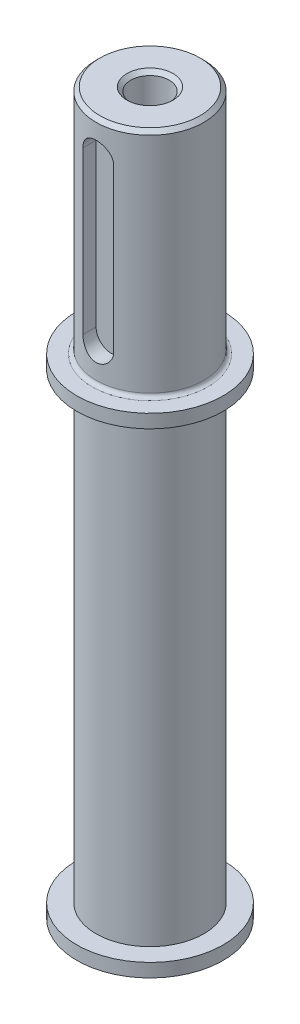
ISO-10303-21;
HEADER;
FILE_DESCRIPTION(('STEP AP214'),'2;1');
FILE_NAME('part.step','',(''),(''),'','','');
FILE_SCHEMA(('AUTOMOTIVE_DESIGN { 1 0 10303 214 1 1 1 1 }'));
ENDSEC;
DATA;
#1=APPLICATION_CONTEXT('core data for automotive mechanical design processes');
#2=APPLICATION_PROTOCOL_DEFINITION('international standard','automotive_design',2000,#1);
#3=PRODUCT_CONTEXT('',#1,'mechanical');
#4=PRODUCT('Part','Part','',(#3));
#5=PRODUCT_RELATED_PRODUCT_CATEGORY('part','',(#4));
#6=PRODUCT_DEFINITION_FORMATION('','',#4);
#7=PRODUCT_DEFINITION_CONTEXT('part definition',#1,'design');
#8=PRODUCT_DEFINITION('design','',#6,#7);
#9=PRODUCT_DEFINITION_SHAPE('','',#8);
#10=(LENGTH_UNIT() NAMED_UNIT(*) SI_UNIT(.MILLI.,.METRE.));
#11=(NAMED_UNIT(*) PLANE_ANGLE_UNIT() SI_UNIT($,.RADIAN.));
#12=(NAMED_UNIT(*) SI_UNIT($,.STERADIAN.) SOLID_ANGLE_UNIT());
#13=UNCERTAINTY_MEASURE_WITH_UNIT(LENGTH_MEASURE(1.E-05),#10,'distance_accuracy_value','');
#14=(GEOMETRIC_REPRESENTATION_CONTEXT(3) GLOBAL_UNCERTAINTY_ASSIGNED_CONTEXT((#13)) GLOBAL_UNIT_ASSIGNED_CONTEXT((#10,
#11,#12)) REPRESENTATION_CONTEXT('',''));
#15=CARTESIAN_POINT('',(0.,0.,0.));
#16=DIRECTION('',(0.,0.,1.));
#17=DIRECTION('',(1.,0.,0.));
#18=AXIS2_PLACEMENT_3D('',#15,#16,#17);
#19=CARTESIAN_POINT('',(0.,108.499999999879,0.));
#20=DIRECTION('',(0.,1.,0.));
#21=DIRECTION('',(0.,0.,1.));
#22=AXIS2_PLACEMENT_3D('',#19,#20,#21);
#23=CONICAL_SURFACE('',#22,4.99999999993861,0.785398163357658);
#24=CARTESIAN_POINT('',(1.13686837721616E-10,103.499999999826,0.));
#25=VERTEX_POINT('',#24);
#26=VERTEX_LOOP('',#25);
#27=FACE_BOUND('',#26,.T.);
#28=CARTESIAN_POINT('',(0.,108.5,0.));
#29=DIRECTION('',(0.,1.,0.));
#30=DIRECTION('',(0.,0.,1.));
#31=AXIS2_PLACEMENT_3D('',#28,#29,#30);
#32=CIRCLE('',#31,5.);
#33=CARTESIAN_POINT('',(0.,108.5,5.00000000000001));
#34=VERTEX_POINT('',#33);
#35=EDGE_CURVE('E67',#34,#34,#32,.T.);
#36=ORIENTED_EDGE('',*,*,#35,.T.);
#37=EDGE_LOOP('',(#36));
#38=FACE_BOUND('',#37,.T.);
#39=ADVANCED_FACE('F16',(#27,#38),#23,.F.);
#40=CARTESIAN_POINT('',(0.,103.5,0.));
#41=DIRECTION('',(0.,1.,0.));
#42=DIRECTION('',(0.,0.,1.));
#43=AXIS2_PLACEMENT_3D('',#40,#41,#42);
#44=CYLINDRICAL_SURFACE('',#43,5.);
#45=ORIENTED_EDGE('',*,*,#35,.F.);
#46=EDGE_LOOP('',(#45));
#47=FACE_BOUND('',#46,.T.);
#48=CARTESIAN_POINT('',(0.,122.499999999945,0.));
#49=DIRECTION('',(0.,1.,0.));
#50=DIRECTION('',(-1.,0.,0.));
#51=AXIS2_PLACEMENT_3D('',#48,#49,#50);
#52=CIRCLE('',#51,4.99999999999545);
#53=CARTESIAN_POINT('',(-4.99999999999545,122.499999999945,0.));
#54=VERTEX_POINT('',#53);
#55=EDGE_CURVE('E69',#54,#54,#52,.T.);
#56=ORIENTED_EDGE('',*,*,#55,.T.);
#57=EDGE_LOOP('',(#56));
#58=FACE_BOUND('',#57,.T.);
#59=ADVANCED_FACE('F64',(#47,#58),#44,.F.);
#60=CARTESIAN_POINT('',(0.,123.499999999865,0.));
#61=DIRECTION('',(0.,1.,0.));
#62=DIRECTION('',(0.,0.,1.));
#63=AXIS2_PLACEMENT_3D('',#60,#61,#62);
#64=CONICAL_SURFACE('',#63,5.99999999991496,0.78539816342587);
#65=CARTESIAN_POINT('',(0.,123.499999999922,0.));
#66=DIRECTION('',(0.,1.,0.));
#67=DIRECTION('',(0.,0.,1.));
#68=AXIS2_PLACEMENT_3D('',#65,#66,#67);
#69=CIRCLE('',#68,5.99999999997181);
#70=CARTESIAN_POINT('',(0.,123.499999999922,5.99999999997181));
#71=VERTEX_POINT('',#70);
#72=EDGE_CURVE('E19',#71,#71,#69,.F.);
#73=ORIENTED_EDGE('',*,*,#72,.F.);
#74=EDGE_LOOP('',(#73));
#75=FACE_BOUND('',#74,.T.);
#76=ORIENTED_EDGE('',*,*,#55,.F.);
#77=EDGE_LOOP('',(#76));
#78=FACE_BOUND('',#77,.T.);
#79=ADVANCED_FACE('F293',(#75,#78),#64,.F.);
#80=CARTESIAN_POINT('',(0.,123.5,0.));
#81=DIRECTION('',(0.,1.,0.));
#82=DIRECTION('',(0.,0.,1.));
#83=AXIS2_PLACEMENT_3D('',#80,#81,#82);
#84=PLANE('',#83);
#85=ORIENTED_EDGE('',*,*,#72,.T.);
#86=EDGE_LOOP('',(#85));
#87=FACE_BOUND('',#86,.T.);
#88=CARTESIAN_POINT('',(0.,123.5,0.));
#89=DIRECTION('',(0.,-1.,0.));
#90=DIRECTION('',(0.,0.,-1.));
#91=AXIS2_PLACEMENT_3D('',#88,#89,#90);
#92=CIRCLE('',#91,13.);
#93=CARTESIAN_POINT('',(0.,123.5,-13.));
#94=VERTEX_POINT('',#93);
#95=EDGE_CURVE('E169',#94,#94,#92,.T.);
#96=ORIENTED_EDGE('',*,*,#95,.F.);
#97=EDGE_LOOP('',(#96));
#98=FACE_BOUND('',#97,.T.);
#99=ADVANCED_FACE('F284',(#87,#98),#84,.T.);
#100=CARTESIAN_POINT('',(0.,0.,10.));
#101=DIRECTION('',(0.,0.,1.));
#102=DIRECTION('',(1.,0.,0.));
#103=AXIS2_PLACEMENT_3D('',#100,#101,#102);
#104=PLANE('',#103);
#105=CARTESIAN_POINT('',(0.,114.5,10.));
#106=DIRECTION('',(0.,0.,-1.));
#107=DIRECTION('',(-1.,0.,0.));
#108=AXIS2_PLACEMENT_3D('',#105,#106,#107);
#109=CIRCLE('',#108,4.);
#110=CARTESIAN_POINT('',(4.,114.5,10.));
#111=VERTEX_POINT('',#110);
#112=CARTESIAN_POINT('',(-3.99999999999999,114.5,10.));
#113=VERTEX_POINT('',#112);
#114=EDGE_CURVE('E58',#111,#113,#109,.F.);
#115=ORIENTED_EDGE('',*,*,#114,.T.);
#116=DIRECTION('',(0.,-1.,0.));
#117=VECTOR('',#116,1.);
#118=CARTESIAN_POINT('',(-3.99999999999999,118.5,10.));
#119=LINE('',#118,#117);
#120=CARTESIAN_POINT('',(-3.99999999999999,72.5,10.));
#121=VERTEX_POINT('',#120);
#122=EDGE_CURVE('E168',#113,#121,#119,.T.);
#123=ORIENTED_EDGE('',*,*,#122,.T.);
#124=CARTESIAN_POINT('',(0.,72.5,10.));
#125=DIRECTION('',(0.,0.,-1.));
#126=DIRECTION('',(-1.,0.,0.));
#127=AXIS2_PLACEMENT_3D('',#124,#125,#126);
#128=CIRCLE('',#127,4.);
#129=CARTESIAN_POINT('',(4.,72.5,10.));
#130=VERTEX_POINT('',#129);
#131=EDGE_CURVE('E159',#121,#130,#128,.F.);
#132=ORIENTED_EDGE('',*,*,#131,.T.);
#133=DIRECTION('',(0.,1.,0.));
#134=VECTOR('',#133,1.);
#135=CARTESIAN_POINT('',(4.,68.5,10.));
#136=LINE('',#135,#134);
#137=EDGE_CURVE('E56',#130,#111,#136,.T.);
#138=ORIENTED_EDGE('',*,*,#137,.T.);
#139=EDGE_LOOP('',(#115,#123,#132,#138));
#140=FACE_BOUND('',#139,.T.);
#141=ADVANCED_FACE('F176',(#140),#104,.T.);
#142=CARTESIAN_POINT('',(0.,122.5,0.));
#143=DIRECTION('',(0.,-1.,0.));
#144=DIRECTION('',(0.,0.,-1.));
#145=AXIS2_PLACEMENT_3D('',#142,#143,#144);
#146=CONICAL_SURFACE('',#145,14.,0.785398163397447);
#147=CARTESIAN_POINT('',(0.,122.5,0.));
#148=DIRECTION('',(0.,1.,0.));
#149=DIRECTION('',(0.,0.,1.));
#150=AXIS2_PLACEMENT_3D('',#147,#148,#149);
#151=CIRCLE('',#150,14.);
#152=CARTESIAN_POINT('',(0.,122.5,14.));
#153=VERTEX_POINT('',#152);
#154=EDGE_CURVE('E153',#153,#153,#151,.F.);
#155=ORIENTED_EDGE('',*,*,#154,.F.);
#156=EDGE_LOOP('',(#155));
#157=FACE_BOUND('',#156,.T.);
#158=ORIENTED_EDGE('',*,*,#95,.T.);
#159=EDGE_LOOP('',(#158));
#160=FACE_BOUND('',#159,.T.);
#161=ADVANCED_FACE('F190',(#157,#160),#146,.T.);
#162=CARTESIAN_POINT('',(-3.99999999999999,118.5,10.));
#163=DIRECTION('',(-1.,0.,0.));
#164=DIRECTION('',(0.,-1.,0.));
#165=AXIS2_PLACEMENT_3D('',#162,#163,#164);
#166=PLANE('',#165);
#167=ORIENTED_EDGE('',*,*,#122,.F.);
#168=DIRECTION('',(0.,0.,-1.));
#169=VECTOR('',#168,1.);
#170=CARTESIAN_POINT('',(-3.99999999999999,114.5,-6.));
#171=LINE('',#170,#169);
#172=CARTESIAN_POINT('',(-4.,114.5,13.4164078649987));
#173=VERTEX_POINT('',#172);
#174=EDGE_CURVE('E165',#113,#173,#171,.F.);
#175=ORIENTED_EDGE('',*,*,#174,.T.);
#176=DIRECTION('',(0.,1.,0.));
#177=VECTOR('',#176,1.);
#178=CARTESIAN_POINT('',(-4.00000000000002,63.5,13.4164078649987));
#179=LINE('',#178,#177);
#180=CARTESIAN_POINT('',(-4.00000000000001,72.5,13.4164078649987));
#181=VERTEX_POINT('',#180);
#182=EDGE_CURVE('E150',#181,#173,#179,.T.);
#183=ORIENTED_EDGE('',*,*,#182,.F.);
#184=DIRECTION('',(0.,0.,-1.));
#185=VECTOR('',#184,1.);
#186=CARTESIAN_POINT('',(-4.,72.5,-6.));
#187=LINE('',#186,#185);
#188=EDGE_CURVE('E160',#181,#121,#187,.T.);
#189=ORIENTED_EDGE('',*,*,#188,.T.);
#190=EDGE_LOOP('',(#167,#175,#183,#189));
#191=FACE_BOUND('',#190,.T.);
#192=ADVANCED_FACE('F188',(#191),#166,.F.);
#193=CARTESIAN_POINT('',(0.,114.5,-6.));
#194=DIRECTION('',(0.,0.,-1.));
#195=DIRECTION('',(-1.,0.,0.));
#196=AXIS2_PLACEMENT_3D('',#193,#194,#195);
#197=CYLINDRICAL_SURFACE('',#196,4.);
#198=ORIENTED_EDGE('',*,*,#174,.F.);
#199=ORIENTED_EDGE('',*,*,#114,.F.);
#200=DIRECTION('',(0.,0.,1.));
#201=VECTOR('',#200,1.);
#202=CARTESIAN_POINT('',(4.,114.5,10.));
#203=LINE('',#202,#201);
#204=CARTESIAN_POINT('',(4.00000000000001,114.5,13.4164078649987));
#205=VERTEX_POINT('',#204);
#206=EDGE_CURVE('E163',#111,#205,#203,.T.);
#207=ORIENTED_EDGE('',*,*,#206,.T.);
#208=CARTESIAN_POINT('',(-3.99999999999999,114.5,13.4164078649987));
#209=CARTESIAN_POINT('',(-4.00001343424813,114.610036938265,13.4163934343768));
#210=CARTESIAN_POINT('',(-3.99545969266926,114.720065459872,13.417761265702));
#211=CARTESIAN_POINT('',(-3.97732232121694,114.939287989373,13.4231542734801));
#212=CARTESIAN_POINT('',(-3.96374056379898,115.048482165565,13.4271788988993));
#213=CARTESIAN_POINT('',(-3.9276941503832,115.265008682582,13.4377658850065));
#214=CARTESIAN_POINT('',(-3.90525054417986,115.372344810754,13.4443222312206));
#215=CARTESIAN_POINT('',(-3.85169716989988,115.584633002554,13.4597622573638));
#216=CARTESIAN_POINT('',(-3.82058720849961,115.689585012944,13.4686459892105));
#217=CARTESIAN_POINT('',(-3.71462722105447,115.999717642999,13.4984072106126));
#218=CARTESIAN_POINT('',(-3.62710377190381,116.200432400308,13.5224082651875));
#219=CARTESIAN_POINT('',(-3.42099335445292,116.584316862067,13.5760110031023));
#220=CARTESIAN_POINT('',(-3.30239378136283,116.767479405898,13.6056149576788));
#221=CARTESIAN_POINT('',(-3.03385514387187,117.116369404888,13.6680345915527));
#222=CARTESIAN_POINT('',(-2.88318637668457,117.28152502006,13.7009134336833));
#223=CARTESIAN_POINT('',(-2.55635049218507,117.58460135598,13.7656378360175));
#224=CARTESIAN_POINT('',(-2.38017915468805,117.722517560181,13.7974832241344));
#225=CARTESIAN_POINT('',(-2.00328797864419,117.96965938831,13.8572672913436));
#226=CARTESIAN_POINT('',(-1.80217262010784,118.07830390558,13.8851223262961));
#227=CARTESIAN_POINT('',(-1.38360719231064,118.260007003573,13.9330517158678));
#228=CARTESIAN_POINT('',(-1.16616104383812,118.333074094601,13.9531279309862));
#229=CARTESIAN_POINT('',(-0.727119470413186,118.439668316764,13.9827902284191));
#230=CARTESIAN_POINT('',(-0.505780313916721,118.474177311461,13.9926363331616));
#231=CARTESIAN_POINT('',(-0.0602449633135568,118.505773527505,14.0016419286283));
#232=CARTESIAN_POINT('',(0.163950738694269,118.502867109631,14.0008032358133));
#233=CARTESIAN_POINT('',(0.601961495843519,118.460387183875,13.9887201082301));
#234=CARTESIAN_POINT('',(0.815889248066131,118.421876540054,13.9777773149304));
#235=CARTESIAN_POINT('',(1.2341066368749,118.311008876966,13.9470775079522));
#236=CARTESIAN_POINT('',(1.43839578630406,118.238650148951,13.9273200492871));
#237=CARTESIAN_POINT('',(1.8341490169319,118.061381109693,13.8807804985664));
#238=CARTESIAN_POINT('',(2.02544821255193,117.956123112831,13.853923872396));
#239=CARTESIAN_POINT('',(2.38801825135016,117.716306263055,13.7960546774321));
#240=CARTESIAN_POINT('',(2.55928501856377,117.581741463019,13.7650412656095));
#241=CARTESIAN_POINT('',(2.88324485398745,117.281613203087,13.7009177251593));
#242=CARTESIAN_POINT('',(3.03507809124177,117.115129667492,13.6677722027509));
#243=CARTESIAN_POINT('',(3.30897556854653,116.758573557128,13.6040627781022));
#244=CARTESIAN_POINT('',(3.43103136574906,116.568494315225,13.573499609643));
#245=CARTESIAN_POINT('',(3.58945338157004,116.268841328102,13.5321405016799));
#246=CARTESIAN_POINT('',(3.63832313759783,116.166010156567,13.5190503394637));
#247=CARTESIAN_POINT('',(3.72718558970199,115.956373741282,13.4948216745023));
#248=CARTESIAN_POINT('',(3.767181890327,115.849570131867,13.4836823796704));
#249=CARTESIAN_POINT('',(3.83791732102718,115.632861334789,13.463719461374));
#250=CARTESIAN_POINT('',(3.86866612224974,115.522959519801,13.4548934199316));
#251=CARTESIAN_POINT('',(3.92067829243349,115.300804060039,13.4398293634308));
#252=CARTESIAN_POINT('',(3.94194605597151,115.188551530165,13.4335901494402));
#253=CARTESIAN_POINT('',(3.97223001063664,114.980267797862,13.4246640965205));
#254=CARTESIAN_POINT('',(3.98264484818435,114.884454640876,13.4215735027143));
#255=CARTESIAN_POINT('',(3.99652828145244,114.692430219405,13.4174428037393));
#256=CARTESIAN_POINT('',(4.00000747148811,114.596219787408,13.4163995712304));
#257=CARTESIAN_POINT('',(4.00000000000001,114.5,13.4164078649987));
#258=B_SPLINE_CURVE_WITH_KNOTS('',3,(#208,#209,#210,#211,#212,#213,#214,#215,#216,#217,#218,
#219,#220,#221,#222,#223,#224,#225,#226,#227,#228,#229,#230,#231,#232,#233,#234,#235,#236,#237,
#238,#239,#240,#241,#242,#243,#244,#245,#246,#247,#248,#249,#250,#251,#252,#253,#254,#255,#256,
#257),.UNSPECIFIED.,.F.,.F.,(4,2,2,2,2,2,2,2,2,2,2,2,2,2,2,2,2,2,2,2,2,2,2,2,4),(0.,
0.329993743043637,0.65991906508638,0.98906537585001,1.31821902959231,1.97575167696556,
2.6335514401874,3.30832474645299,3.98320984263716,4.67064278038706,5.35791119973408,
6.02724874934373,6.69647251025092,7.34634193868018,7.99624417788575,8.65326120487288,
9.31041168231765,9.99056134493198,10.6709036279931,11.0143588121194,11.357674222404,
11.700629330619,12.0434253092463,12.3324405185763,12.6210139131113),.UNSPECIFIED.);
#259=EDGE_CURVE('E103',#173,#205,#258,.T.);
#260=ORIENTED_EDGE('',*,*,#259,.F.);
#261=EDGE_LOOP('',(#198,#199,#207,#260));
#262=FACE_BOUND('',#261,.T.);
#263=ADVANCED_FACE('F186',(#262),#197,.F.);
#264=CARTESIAN_POINT('',(4.,68.5,10.));
#265=DIRECTION('',(1.,0.,0.));
#266=DIRECTION('',(0.,1.,0.));
#267=AXIS2_PLACEMENT_3D('',#264,#265,#266);
#268=PLANE('',#267);
#269=DIRECTION('',(0.,1.,0.));
#270=VECTOR('',#269,1.);
#271=CARTESIAN_POINT('',(4.00000000000002,63.5,13.4164078649987));
#272=LINE('',#271,#270);
#273=CARTESIAN_POINT('',(4.00000000000001,72.5,13.4164078649987));
#274=VERTEX_POINT('',#273);
#275=EDGE_CURVE('E102',#205,#274,#272,.F.);
#276=ORIENTED_EDGE('',*,*,#275,.F.);
#277=ORIENTED_EDGE('',*,*,#206,.F.);
#278=ORIENTED_EDGE('',*,*,#137,.F.);
#279=DIRECTION('',(0.,0.,-1.));
#280=VECTOR('',#279,1.);
#281=CARTESIAN_POINT('',(4.,72.5,-6.));
#282=LINE('',#281,#280);
#283=EDGE_CURVE('E34',#130,#274,#282,.F.);
#284=ORIENTED_EDGE('',*,*,#283,.T.);
#285=EDGE_LOOP('',(#276,#277,#278,#284));
#286=FACE_BOUND('',#285,.T.);
#287=ADVANCED_FACE('F180',(#286),#268,.F.);
#288=CARTESIAN_POINT('',(0.,72.5,-6.));
#289=DIRECTION('',(0.,0.,-1.));
#290=DIRECTION('',(-1.,0.,0.));
#291=AXIS2_PLACEMENT_3D('',#288,#289,#290);
#292=CYLINDRICAL_SURFACE('',#291,4.);
#293=ORIENTED_EDGE('',*,*,#283,.F.);
#294=ORIENTED_EDGE('',*,*,#131,.F.);
#295=ORIENTED_EDGE('',*,*,#188,.F.);
#296=CARTESIAN_POINT('',(4.,72.5,13.4164078649987));
#297=CARTESIAN_POINT('',(4.00001343424814,72.3899630617349,13.4163934343768));
#298=CARTESIAN_POINT('',(3.99545969266927,72.2799345401276,13.417761265702));
#299=CARTESIAN_POINT('',(3.97732232121695,72.060712010627,13.4231542734801));
#300=CARTESIAN_POINT('',(3.96374056379899,71.9515178344354,13.4271788988993));
#301=CARTESIAN_POINT('',(3.92769415038322,71.7349913174175,13.4377658850065));
#302=CARTESIAN_POINT('',(3.90525054417987,71.6276551892464,13.4443222312206));
#303=CARTESIAN_POINT('',(3.85169716989989,71.4153669974456,13.4597622573638));
#304=CARTESIAN_POINT('',(3.82058720849962,71.3104149870559,13.4686459892105));
#305=CARTESIAN_POINT('',(3.71462722105448,71.0002823570005,13.4984072106126));
#306=CARTESIAN_POINT('',(3.62710377190382,70.7995675996925,13.5224082651875));
#307=CARTESIAN_POINT('',(3.42099335445292,70.4156831379329,13.5760110031023));
#308=CARTESIAN_POINT('',(3.30239378136284,70.232520594102,13.6056149576788));
#309=CARTESIAN_POINT('',(3.03385514387188,69.8836305951117,13.6680345915527));
#310=CARTESIAN_POINT('',(2.88318637668458,69.71847497994,13.7009134336833));
#311=CARTESIAN_POINT('',(2.55635049218508,69.4153986440201,13.7656378360175));
#312=CARTESIAN_POINT('',(2.38017915468807,69.2774824398191,13.7974832241344));
#313=CARTESIAN_POINT('',(2.00328797864421,69.03034061169,13.8572672913436));
#314=CARTESIAN_POINT('',(1.80217262010785,68.92169609442,13.8851223262961));
#315=CARTESIAN_POINT('',(1.38360719231065,68.7399929964269,13.9330517158678));
#316=CARTESIAN_POINT('',(1.16616104383813,68.6669259053991,13.9531279309862));
#317=CARTESIAN_POINT('',(0.727119470413197,68.5603316832356,13.9827902284191));
#318=CARTESIAN_POINT('',(0.505780313916732,68.5258226885391,13.9926363331616));
#319=CARTESIAN_POINT('',(0.0602449633135678,68.4942264724947,14.0016419286283));
#320=CARTESIAN_POINT('',(-0.163950738694258,68.4971328903689,14.0008032358133));
#321=CARTESIAN_POINT('',(-0.601961495843509,68.5396128161252,13.9887201082301));
#322=CARTESIAN_POINT('',(-0.81588924806612,68.5781234599459,13.9777773149304));
#323=CARTESIAN_POINT('',(-1.23410663687489,68.6889911230344,13.9470775079522));
#324=CARTESIAN_POINT('',(-1.43839578630405,68.7613498510487,13.9273200492871));
#325=CARTESIAN_POINT('',(-1.83414901693189,68.9386188903073,13.8807804985664));
#326=CARTESIAN_POINT('',(-2.02544821255192,69.0438768871686,13.853923872396));
#327=CARTESIAN_POINT('',(-2.38801825135015,69.283693736945,13.7960546774321));
#328=CARTESIAN_POINT('',(-2.55928501856376,69.4182585369809,13.7650412656095));
#329=CARTESIAN_POINT('',(-2.88324485398744,69.7183867969127,13.7009177251593));
#330=CARTESIAN_POINT('',(-3.03507809124176,69.8848703325082,13.6677722027509));
#331=CARTESIAN_POINT('',(-3.30897556854651,70.2414264428721,13.6040627781022));
#332=CARTESIAN_POINT('',(-3.43103136574905,70.4315056847752,13.573499609643));
#333=CARTESIAN_POINT('',(-3.58945338157003,70.7311586718983,13.5321405016799));
#334=CARTESIAN_POINT('',(-3.63832313759782,70.8339898434328,13.5190503394637));
#335=CARTESIAN_POINT('',(-3.72718558970198,71.0436262587177,13.4948216745023));
#336=CARTESIAN_POINT('',(-3.767181890327,71.1504298681334,13.4836823796704));
#337=CARTESIAN_POINT('',(-3.83791732102717,71.3671386652105,13.463719461374));
#338=CARTESIAN_POINT('',(-3.86866612224973,71.4770404801988,13.4548934199316));
#339=CARTESIAN_POINT('',(-3.92067829243348,71.6991959399608,13.4398293634308));
#340=CARTESIAN_POINT('',(-3.94194605597149,71.8114484698354,13.4335901494402));
#341=CARTESIAN_POINT('',(-3.97223001063663,72.0197322021381,13.4246640965205));
#342=CARTESIAN_POINT('',(-3.98264484818433,72.1155453591243,13.4215735027143));
#343=CARTESIAN_POINT('',(-3.99652828145243,72.3075697805955,13.4174428037393));
#344=CARTESIAN_POINT('',(-4.0000074714881,72.403780212592,13.4163995712304));
#345=CARTESIAN_POINT('',(-4.,72.5,13.4164078649987));
#346=B_SPLINE_CURVE_WITH_KNOTS('',3,(#296,#297,#298,#299,#300,#301,#302,#303,#304,#305,#306,
#307,#308,#309,#310,#311,#312,#313,#314,#315,#316,#317,#318,#319,#320,#321,#322,#323,#324,#325,
#326,#327,#328,#329,#330,#331,#332,#333,#334,#335,#336,#337,#338,#339,#340,#341,#342,#343,#344,
#345),.UNSPECIFIED.,.F.,.F.,(4,2,2,2,2,2,2,2,2,2,2,2,2,2,2,2,2,2,2,2,2,2,2,2,4),(0.,
0.329993743043637,0.65991906508638,0.98906537585001,1.31821902959231,1.97575167696559,
2.6335514401874,3.30832474645299,3.98320984263716,4.67064278038706,5.35791119973408,
6.02724874934373,6.69647251025092,7.34634193868018,7.99624417788575,8.65326120487288,
9.31041168231765,9.99056134493199,10.6709036279931,11.0143588121194,11.357674222404,
11.700629330619,12.0434253092463,12.3324405185763,12.6210139131113),.UNSPECIFIED.);
#347=EDGE_CURVE('E93',#274,#181,#346,.T.);
#348=ORIENTED_EDGE('',*,*,#347,.F.);
#349=EDGE_LOOP('',(#293,#294,#295,#348));
#350=FACE_BOUND('',#349,.T.);
#351=ADVANCED_FACE('F109',(#350),#292,.F.);
#352=CARTESIAN_POINT('',(0.,63.5,0.));
#353=DIRECTION('',(0.,1.,0.));
#354=DIRECTION('',(0.,0.,1.));
#355=AXIS2_PLACEMENT_3D('',#352,#353,#354);
#356=CYLINDRICAL_SURFACE('',#355,14.);
#357=ORIENTED_EDGE('',*,*,#275,.T.);
#358=ORIENTED_EDGE('',*,*,#347,.T.);
#359=ORIENTED_EDGE('',*,*,#182,.T.);
#360=ORIENTED_EDGE('',*,*,#259,.T.);
#361=EDGE_LOOP('',(#357,#358,#359,#360));
#362=FACE_BOUND('',#361,.T.);
#363=CARTESIAN_POINT('',(0.,64.5,0.));
#364=DIRECTION('',(0.,1.,0.));
#365=DIRECTION('',(-1.,0.,0.));
#366=AXIS2_PLACEMENT_3D('',#363,#364,#365);
#367=CIRCLE('',#366,14.);
#368=CARTESIAN_POINT('',(-14.,64.5,0.));
#369=VERTEX_POINT('',#368);
#370=EDGE_CURVE('E101',#369,#369,#367,.T.);
#371=ORIENTED_EDGE('',*,*,#370,.T.);
#372=EDGE_LOOP('',(#371));
#373=FACE_BOUND('',#372,.T.);
#374=ORIENTED_EDGE('',*,*,#154,.T.);
#375=EDGE_LOOP('',(#374));
#376=FACE_BOUND('',#375,.T.);
#377=ADVANCED_FACE('F112',(#362,#373,#376),#356,.T.);
#378=CARTESIAN_POINT('',(0.,64.5,0.));
#379=DIRECTION('',(0.,1.,0.));
#380=DIRECTION('',(-1.,0.,0.));
#381=AXIS2_PLACEMENT_3D('',#378,#379,#380);
#382=TOROIDAL_SURFACE('',#381,15.,1.);
#383=CARTESIAN_POINT('',(0.,63.5,0.));
#384=DIRECTION('',(0.,1.,0.));
#385=DIRECTION('',(-1.,0.,0.));
#386=AXIS2_PLACEMENT_3D('',#383,#384,#385);
#387=CIRCLE('',#386,15.);
#388=CARTESIAN_POINT('',(-15.,63.5,0.));
#389=VERTEX_POINT('',#388);
#390=EDGE_CURVE('E92',#389,#389,#387,.F.);
#391=ORIENTED_EDGE('',*,*,#390,.F.);
#392=EDGE_LOOP('',(#391));
#393=FACE_BOUND('',#392,.T.);
#394=ORIENTED_EDGE('',*,*,#370,.F.);
#395=EDGE_LOOP('',(#394));
#396=FACE_BOUND('',#395,.T.);
#397=ADVANCED_FACE('F116',(#393,#396),#382,.F.);
#398=CARTESIAN_POINT('',(0.,63.5,0.));
#399=DIRECTION('',(0.,1.,0.));
#400=DIRECTION('',(0.,0.,1.));
#401=AXIS2_PLACEMENT_3D('',#398,#399,#400);
#402=PLANE('',#401);
#403=ORIENTED_EDGE('',*,*,#390,.T.);
#404=EDGE_LOOP('',(#403));
#405=FACE_BOUND('',#404,.T.);
#406=CARTESIAN_POINT('',(0.,63.5,0.));
#407=DIRECTION('',(0.,1.,0.));
#408=DIRECTION('',(0.,0.,1.));
#409=AXIS2_PLACEMENT_3D('',#406,#407,#408);
#410=CIRCLE('',#409,19.);
#411=CARTESIAN_POINT('',(0.,63.5,19.));
#412=VERTEX_POINT('',#411);
#413=EDGE_CURVE('E89',#412,#412,#410,.F.);
#414=ORIENTED_EDGE('',*,*,#413,.F.);
#415=EDGE_LOOP('',(#414));
#416=FACE_BOUND('',#415,.T.);
#417=ADVANCED_FACE('F123',(#405,#416),#402,.T.);
#418=CARTESIAN_POINT('',(0.,-63.5,0.));
#419=DIRECTION('',(0.,-1.,0.));
#420=DIRECTION('',(0.,0.,-1.));
#421=AXIS2_PLACEMENT_3D('',#418,#419,#420);
#422=PLANE('',#421);
#423=CARTESIAN_POINT('',(0.,-63.5,0.));
#424=DIRECTION('',(0.,-1.,0.));
#425=DIRECTION('',(0.,0.,-1.));
#426=AXIS2_PLACEMENT_3D('',#423,#424,#425);
#427=CIRCLE('',#426,19.);
#428=CARTESIAN_POINT('',(0.,-63.5,-19.));
#429=VERTEX_POINT('',#428);
#430=EDGE_CURVE('E86',#429,#429,#427,.F.);
#431=ORIENTED_EDGE('',*,*,#430,.F.);
#432=EDGE_LOOP('',(#431));
#433=FACE_BOUND('',#432,.T.);
#434=ADVANCED_FACE('F221',(#433),#422,.T.);
#435=CARTESIAN_POINT('',(0.,60.,0.));
#436=DIRECTION('',(0.,1.,0.));
#437=DIRECTION('',(0.,0.,1.));
#438=AXIS2_PLACEMENT_3D('',#435,#436,#437);
#439=CYLINDRICAL_SURFACE('',#438,19.);
#440=CARTESIAN_POINT('',(0.,60.,0.));
#441=DIRECTION('',(0.,1.,0.));
#442=DIRECTION('',(0.,0.,1.));
#443=AXIS2_PLACEMENT_3D('',#440,#441,#442);
#444=CIRCLE('',#443,19.);
#445=CARTESIAN_POINT('',(0.,60.,19.));
#446=VERTEX_POINT('',#445);
#447=EDGE_CURVE('E83',#446,#446,#444,.T.);
#448=ORIENTED_EDGE('',*,*,#447,.T.);
#449=EDGE_LOOP('',(#448));
#450=FACE_BOUND('',#449,.T.);
#451=ORIENTED_EDGE('',*,*,#413,.T.);
#452=EDGE_LOOP('',(#451));
#453=FACE_BOUND('',#452,.T.);
#454=ADVANCED_FACE('F218',(#450,#453),#439,.T.);
#455=CARTESIAN_POINT('',(0.,-60.,0.));
#456=DIRECTION('',(0.,-1.,0.));
#457=DIRECTION('',(0.,0.,-1.));
#458=AXIS2_PLACEMENT_3D('',#455,#456,#457);
#459=CYLINDRICAL_SURFACE('',#458,19.);
#460=ORIENTED_EDGE('',*,*,#430,.T.);
#461=EDGE_LOOP('',(#460));
#462=FACE_BOUND('',#461,.T.);
#463=CARTESIAN_POINT('',(0.,-60.,0.));
#464=DIRECTION('',(0.,-1.,0.));
#465=DIRECTION('',(0.,0.,-1.));
#466=AXIS2_PLACEMENT_3D('',#463,#464,#465);
#467=CIRCLE('',#466,19.);
#468=CARTESIAN_POINT('',(0.,-60.,-19.));
#469=VERTEX_POINT('',#468);
#470=EDGE_CURVE('E80',#469,#469,#467,.T.);
#471=ORIENTED_EDGE('',*,*,#470,.T.);
#472=EDGE_LOOP('',(#471));
#473=FACE_BOUND('',#472,.T.);
#474=ADVANCED_FACE('F214',(#462,#473),#459,.T.);
#475=CARTESIAN_POINT('',(0.,60.,0.));
#476=DIRECTION('',(0.,1.,0.));
#477=DIRECTION('',(0.,0.,1.));
#478=AXIS2_PLACEMENT_3D('',#475,#476,#477);
#479=PLANE('',#478);
#480=CARTESIAN_POINT('',(0.,60.,0.));
#481=DIRECTION('',(0.,1.,0.));
#482=DIRECTION('',(0.,0.,1.));
#483=AXIS2_PLACEMENT_3D('',#480,#481,#482);
#484=CIRCLE('',#483,14.);
#485=CARTESIAN_POINT('',(0.,60.,14.));
#486=VERTEX_POINT('',#485);
#487=EDGE_CURVE('E25',#486,#486,#484,.F.);
#488=ORIENTED_EDGE('',*,*,#487,.F.);
#489=EDGE_LOOP('',(#488));
#490=FACE_BOUND('',#489,.T.);
#491=ORIENTED_EDGE('',*,*,#447,.F.);
#492=EDGE_LOOP('',(#491));
#493=FACE_BOUND('',#492,.T.);
#494=ADVANCED_FACE('F207',(#490,#493),#479,.F.);
#495=CARTESIAN_POINT('',(0.,-60.,0.));
#496=DIRECTION('',(0.,-1.,0.));
#497=DIRECTION('',(0.,0.,-1.));
#498=AXIS2_PLACEMENT_3D('',#495,#496,#497);
#499=PLANE('',#498);
#500=CARTESIAN_POINT('',(0.,-60.,0.));
#501=DIRECTION('',(0.,1.,0.));
#502=DIRECTION('',(0.,0.,1.));
#503=AXIS2_PLACEMENT_3D('',#500,#501,#502);
#504=CIRCLE('',#503,14.);
#505=CARTESIAN_POINT('',(0.,-60.,14.));
#506=VERTEX_POINT('',#505);
#507=EDGE_CURVE('E10',#506,#506,#504,.T.);
#508=ORIENTED_EDGE('',*,*,#507,.F.);
#509=EDGE_LOOP('',(#508));
#510=FACE_BOUND('',#509,.T.);
#511=ORIENTED_EDGE('',*,*,#470,.F.);
#512=EDGE_LOOP('',(#511));
#513=FACE_BOUND('',#512,.T.);
#514=ADVANCED_FACE('F201',(#510,#513),#499,.F.);
#515=CARTESIAN_POINT('',(0.,-60.,0.));
#516=DIRECTION('',(0.,1.,0.));
#517=DIRECTION('',(0.,0.,1.));
#518=AXIS2_PLACEMENT_3D('',#515,#516,#517);
#519=CYLINDRICAL_SURFACE('',#518,14.);
#520=ORIENTED_EDGE('',*,*,#507,.T.);
#521=EDGE_LOOP('',(#520));
#522=FACE_BOUND('',#521,.T.);
#523=ORIENTED_EDGE('',*,*,#487,.T.);
#524=EDGE_LOOP('',(#523));
#525=FACE_BOUND('',#524,.T.);
#526=ADVANCED_FACE('F199',(#522,#525),#519,.T.);
#527=CLOSED_SHELL('',(#39,#59,#79,#99,#141,#161,#192,#263,#287,#351,#377,#397,#417,#434,#454,
#474,#494,#514,#526));
#528=MANIFOLD_SOLID_BREP('B1',#527);
#529=ADVANCED_BREP_SHAPE_REPRESENTATION('',(#18,#528),#14);
#530=SHAPE_DEFINITION_REPRESENTATION(#9,#529);
ENDSEC;
END-ISO-10303-21;
